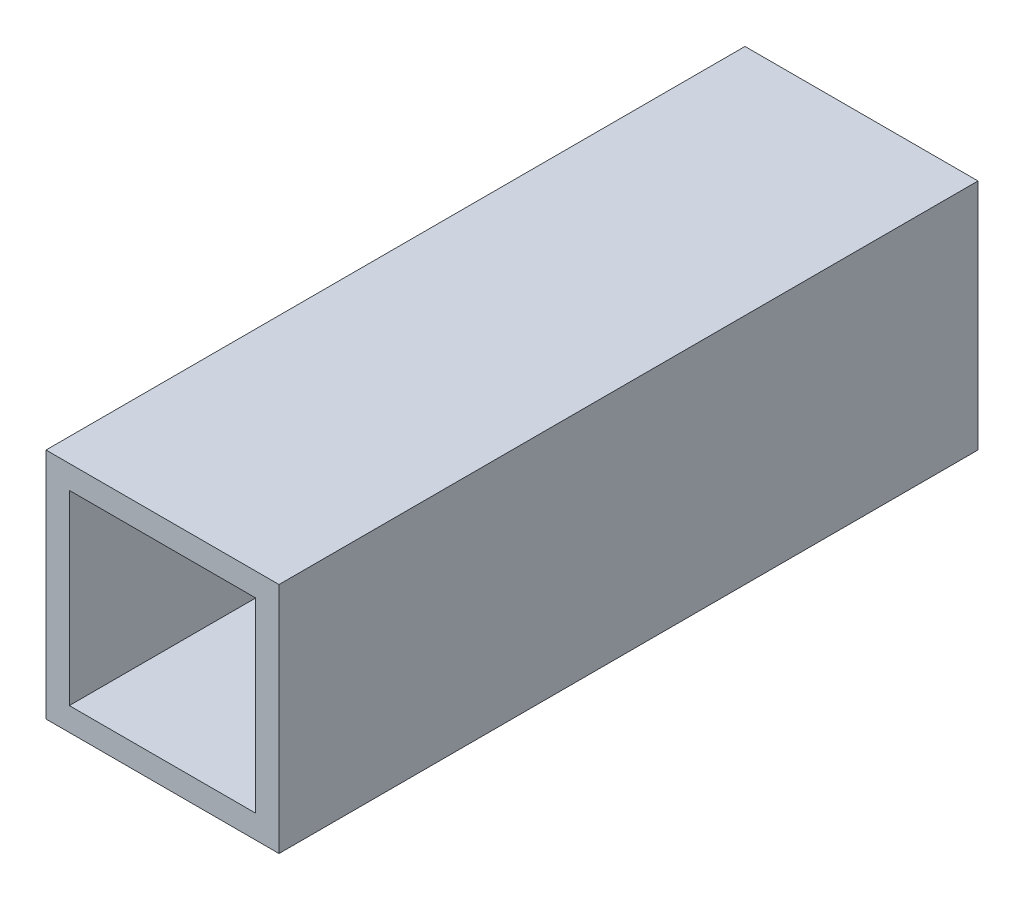
ISO-10303-21;
HEADER;
FILE_DESCRIPTION(('STEP AP214'),'2;1');
FILE_NAME('part.step','',(''),(''),'','','');
FILE_SCHEMA(('AUTOMOTIVE_DESIGN { 1 0 10303 214 1 1 1 1 }'));
ENDSEC;
DATA;
#1=APPLICATION_CONTEXT('core data for automotive mechanical design processes');
#2=APPLICATION_PROTOCOL_DEFINITION('international standard','automotive_design',2000,#1);
#3=PRODUCT_CONTEXT('',#1,'mechanical');
#4=PRODUCT('Part','Part','',(#3));
#5=PRODUCT_RELATED_PRODUCT_CATEGORY('part','',(#4));
#6=PRODUCT_DEFINITION_FORMATION('','',#4);
#7=PRODUCT_DEFINITION_CONTEXT('part definition',#1,'design');
#8=PRODUCT_DEFINITION('design','',#6,#7);
#9=PRODUCT_DEFINITION_SHAPE('','',#8);
#10=(LENGTH_UNIT() NAMED_UNIT(*) SI_UNIT(.MILLI.,.METRE.));
#11=(NAMED_UNIT(*) PLANE_ANGLE_UNIT() SI_UNIT($,.RADIAN.));
#12=(NAMED_UNIT(*) SI_UNIT($,.STERADIAN.) SOLID_ANGLE_UNIT());
#13=UNCERTAINTY_MEASURE_WITH_UNIT(LENGTH_MEASURE(1.E-05),#10,'distance_accuracy_value','');
#14=(GEOMETRIC_REPRESENTATION_CONTEXT(3) GLOBAL_UNCERTAINTY_ASSIGNED_CONTEXT((#13)) GLOBAL_UNIT_ASSIGNED_CONTEXT((#10,
#11,#12)) REPRESENTATION_CONTEXT('',''));
#15=CARTESIAN_POINT('',(0.,0.,0.));
#16=DIRECTION('',(0.,0.,1.));
#17=DIRECTION('',(1.,0.,0.));
#18=AXIS2_PLACEMENT_3D('',#15,#16,#17);
#19=CARTESIAN_POINT('',(-25.,25.,150.));
#20=DIRECTION('',(-1.,0.,0.));
#21=DIRECTION('',(0.,0.,1.));
#22=AXIS2_PLACEMENT_3D('',#19,#20,#21);
#23=PLANE('',#22);
#24=DIRECTION('',(0.,1.,0.));
#25=VECTOR('',#24,1.);
#26=CARTESIAN_POINT('',(-25.,25.,0.));
#27=LINE('',#26,#25);
#28=CARTESIAN_POINT('',(-25.,-25.,0.));
#29=VERTEX_POINT('',#28);
#30=CARTESIAN_POINT('',(-25.,25.,0.));
#31=VERTEX_POINT('',#30);
#32=EDGE_CURVE('E135',#29,#31,#27,.T.);
#33=ORIENTED_EDGE('',*,*,#32,.F.);
#34=DIRECTION('',(0.,0.,-1.));
#35=VECTOR('',#34,1.);
#36=CARTESIAN_POINT('',(-25.,-25.,150.));
#37=LINE('',#36,#35);
#38=CARTESIAN_POINT('',(-25.,-25.,150.));
#39=VERTEX_POINT('',#38);
#40=EDGE_CURVE('E11',#39,#29,#37,.T.);
#41=ORIENTED_EDGE('',*,*,#40,.F.);
#42=DIRECTION('',(0.,1.,0.));
#43=VECTOR('',#42,1.);
#44=CARTESIAN_POINT('',(-25.,25.,150.));
#45=LINE('',#44,#43);
#46=CARTESIAN_POINT('',(-25.,25.,150.));
#47=VERTEX_POINT('',#46);
#48=EDGE_CURVE('E139',#39,#47,#45,.T.);
#49=ORIENTED_EDGE('',*,*,#48,.T.);
#50=DIRECTION('',(0.,0.,-1.));
#51=VECTOR('',#50,1.);
#52=CARTESIAN_POINT('',(-25.,25.,150.));
#53=LINE('',#52,#51);
#54=EDGE_CURVE('E40',#47,#31,#53,.T.);
#55=ORIENTED_EDGE('',*,*,#54,.T.);
#56=EDGE_LOOP('',(#33,#41,#49,#55));
#57=FACE_BOUND('',#56,.T.);
#58=ADVANCED_FACE('F37',(#57),#23,.T.);
#59=CARTESIAN_POINT('',(-25.,-25.,150.));
#60=DIRECTION('',(0.,-1.,0.));
#61=DIRECTION('',(0.,0.,-1.));
#62=AXIS2_PLACEMENT_3D('',#59,#60,#61);
#63=PLANE('',#62);
#64=DIRECTION('',(-1.,0.,0.));
#65=VECTOR('',#64,1.);
#66=CARTESIAN_POINT('',(-25.,-25.,0.));
#67=LINE('',#66,#65);
#68=CARTESIAN_POINT('',(25.,-25.,0.));
#69=VERTEX_POINT('',#68);
#70=EDGE_CURVE('E143',#69,#29,#67,.T.);
#71=ORIENTED_EDGE('',*,*,#70,.F.);
#72=DIRECTION('',(0.,0.,-1.));
#73=VECTOR('',#72,1.);
#74=CARTESIAN_POINT('',(25.,-25.,150.));
#75=LINE('',#74,#73);
#76=CARTESIAN_POINT('',(25.,-25.,150.));
#77=VERTEX_POINT('',#76);
#78=EDGE_CURVE('E45',#77,#69,#75,.T.);
#79=ORIENTED_EDGE('',*,*,#78,.F.);
#80=DIRECTION('',(-1.,0.,0.));
#81=VECTOR('',#80,1.);
#82=CARTESIAN_POINT('',(-25.,-25.,150.));
#83=LINE('',#82,#81);
#84=EDGE_CURVE('E149',#77,#39,#83,.T.);
#85=ORIENTED_EDGE('',*,*,#84,.T.);
#86=ORIENTED_EDGE('',*,*,#40,.T.);
#87=EDGE_LOOP('',(#71,#79,#85,#86));
#88=FACE_BOUND('',#87,.T.);
#89=ADVANCED_FACE('F175',(#88),#63,.T.);
#90=CARTESIAN_POINT('',(25.,25.,150.));
#91=DIRECTION('',(1.,0.,0.));
#92=DIRECTION('',(0.,0.,-1.));
#93=AXIS2_PLACEMENT_3D('',#90,#91,#92);
#94=PLANE('',#93);
#95=DIRECTION('',(0.,-1.,0.));
#96=VECTOR('',#95,1.);
#97=CARTESIAN_POINT('',(25.,25.,0.));
#98=LINE('',#97,#96);
#99=CARTESIAN_POINT('',(25.,25.,0.));
#100=VERTEX_POINT('',#99);
#101=EDGE_CURVE('E157',#100,#69,#98,.T.);
#102=ORIENTED_EDGE('',*,*,#101,.F.);
#103=DIRECTION('',(0.,0.,-1.));
#104=VECTOR('',#103,1.);
#105=CARTESIAN_POINT('',(25.,25.,150.));
#106=LINE('',#105,#104);
#107=CARTESIAN_POINT('',(25.,25.,150.));
#108=VERTEX_POINT('',#107);
#109=EDGE_CURVE('E162',#108,#100,#106,.T.);
#110=ORIENTED_EDGE('',*,*,#109,.F.);
#111=DIRECTION('',(0.,-1.,0.));
#112=VECTOR('',#111,1.);
#113=CARTESIAN_POINT('',(25.,25.,150.));
#114=LINE('',#113,#112);
#115=EDGE_CURVE('E146',#108,#77,#114,.T.);
#116=ORIENTED_EDGE('',*,*,#115,.T.);
#117=ORIENTED_EDGE('',*,*,#78,.T.);
#118=EDGE_LOOP('',(#102,#110,#116,#117));
#119=FACE_BOUND('',#118,.T.);
#120=ADVANCED_FACE('F179',(#119),#94,.T.);
#121=CARTESIAN_POINT('',(-25.,25.,150.));
#122=DIRECTION('',(0.,1.,0.));
#123=DIRECTION('',(0.,0.,1.));
#124=AXIS2_PLACEMENT_3D('',#121,#122,#123);
#125=PLANE('',#124);
#126=DIRECTION('',(1.,0.,0.));
#127=VECTOR('',#126,1.);
#128=CARTESIAN_POINT('',(-25.,25.,0.));
#129=LINE('',#128,#127);
#130=EDGE_CURVE('E154',#31,#100,#129,.T.);
#131=ORIENTED_EDGE('',*,*,#130,.F.);
#132=ORIENTED_EDGE('',*,*,#54,.F.);
#133=DIRECTION('',(1.,0.,0.));
#134=VECTOR('',#133,1.);
#135=CARTESIAN_POINT('',(-25.,25.,150.));
#136=LINE('',#135,#134);
#137=EDGE_CURVE('E142',#47,#108,#136,.T.);
#138=ORIENTED_EDGE('',*,*,#137,.T.);
#139=ORIENTED_EDGE('',*,*,#109,.T.);
#140=EDGE_LOOP('',(#131,#132,#138,#139));
#141=FACE_BOUND('',#140,.T.);
#142=ADVANCED_FACE('F170',(#141),#125,.T.);
#143=CARTESIAN_POINT('',(0.,0.,150.));
#144=DIRECTION('',(0.,0.,1.));
#145=DIRECTION('',(1.,0.,0.));
#146=AXIS2_PLACEMENT_3D('',#143,#144,#145);
#147=PLANE('',#146);
#148=DIRECTION('',(1.,0.,0.));
#149=VECTOR('',#148,1.);
#150=CARTESIAN_POINT('',(-20.,20.,150.));
#151=LINE('',#150,#149);
#152=CARTESIAN_POINT('',(-20.,20.,150.));
#153=VERTEX_POINT('',#152);
#154=CARTESIAN_POINT('',(20.,20.,150.));
#155=VERTEX_POINT('',#154);
#156=EDGE_CURVE('E104',#153,#155,#151,.T.);
#157=ORIENTED_EDGE('',*,*,#156,.T.);
#158=DIRECTION('',(0.,-1.,0.));
#159=VECTOR('',#158,1.);
#160=CARTESIAN_POINT('',(20.,20.,150.));
#161=LINE('',#160,#159);
#162=CARTESIAN_POINT('',(20.,-20.,150.));
#163=VERTEX_POINT('',#162);
#164=EDGE_CURVE('E113',#155,#163,#161,.T.);
#165=ORIENTED_EDGE('',*,*,#164,.T.);
#166=DIRECTION('',(-1.,0.,0.));
#167=VECTOR('',#166,1.);
#168=CARTESIAN_POINT('',(-20.,-20.,150.));
#169=LINE('',#168,#167);
#170=CARTESIAN_POINT('',(-20.,-20.,150.));
#171=VERTEX_POINT('',#170);
#172=EDGE_CURVE('E53',#163,#171,#169,.T.);
#173=ORIENTED_EDGE('',*,*,#172,.T.);
#174=DIRECTION('',(0.,1.,0.));
#175=VECTOR('',#174,1.);
#176=CARTESIAN_POINT('',(-20.,20.,150.));
#177=LINE('',#176,#175);
#178=EDGE_CURVE('E110',#171,#153,#177,.T.);
#179=ORIENTED_EDGE('',*,*,#178,.T.);
#180=EDGE_LOOP('',(#157,#165,#173,#179));
#181=FACE_BOUND('',#180,.T.);
#182=ORIENTED_EDGE('',*,*,#48,.F.);
#183=ORIENTED_EDGE('',*,*,#84,.F.);
#184=ORIENTED_EDGE('',*,*,#115,.F.);
#185=ORIENTED_EDGE('',*,*,#137,.F.);
#186=EDGE_LOOP('',(#182,#183,#184,#185));
#187=FACE_BOUND('',#186,.T.);
#188=ADVANCED_FACE('F117',(#181,#187),#147,.T.);
#189=CARTESIAN_POINT('',(0.,0.,0.));
#190=DIRECTION('',(0.,0.,1.));
#191=DIRECTION('',(1.,0.,0.));
#192=AXIS2_PLACEMENT_3D('',#189,#190,#191);
#193=PLANE('',#192);
#194=DIRECTION('',(0.,-1.,0.));
#195=VECTOR('',#194,1.);
#196=CARTESIAN_POINT('',(20.,20.,0.));
#197=LINE('',#196,#195);
#198=CARTESIAN_POINT('',(20.,20.,0.));
#199=VERTEX_POINT('',#198);
#200=CARTESIAN_POINT('',(20.,-20.,0.));
#201=VERTEX_POINT('',#200);
#202=EDGE_CURVE('E129',#199,#201,#197,.T.);
#203=ORIENTED_EDGE('',*,*,#202,.F.);
#204=DIRECTION('',(1.,0.,0.));
#205=VECTOR('',#204,1.);
#206=CARTESIAN_POINT('',(-20.,20.,0.));
#207=LINE('',#206,#205);
#208=CARTESIAN_POINT('',(-20.,20.,0.));
#209=VERTEX_POINT('',#208);
#210=EDGE_CURVE('E61',#209,#199,#207,.T.);
#211=ORIENTED_EDGE('',*,*,#210,.F.);
#212=DIRECTION('',(0.,1.,0.));
#213=VECTOR('',#212,1.);
#214=CARTESIAN_POINT('',(-20.,20.,0.));
#215=LINE('',#214,#213);
#216=CARTESIAN_POINT('',(-20.,-20.,0.));
#217=VERTEX_POINT('',#216);
#218=EDGE_CURVE('E120',#217,#209,#215,.T.);
#219=ORIENTED_EDGE('',*,*,#218,.F.);
#220=DIRECTION('',(-1.,0.,0.));
#221=VECTOR('',#220,1.);
#222=CARTESIAN_POINT('',(-20.,-20.,0.));
#223=LINE('',#222,#221);
#224=EDGE_CURVE('E123',#201,#217,#223,.T.);
#225=ORIENTED_EDGE('',*,*,#224,.F.);
#226=EDGE_LOOP('',(#203,#211,#219,#225));
#227=FACE_BOUND('',#226,.T.);
#228=ORIENTED_EDGE('',*,*,#32,.T.);
#229=ORIENTED_EDGE('',*,*,#130,.T.);
#230=ORIENTED_EDGE('',*,*,#101,.T.);
#231=ORIENTED_EDGE('',*,*,#70,.T.);
#232=EDGE_LOOP('',(#228,#229,#230,#231));
#233=FACE_BOUND('',#232,.T.);
#234=ADVANCED_FACE('F172',(#227,#233),#193,.F.);
#235=CARTESIAN_POINT('',(-20.,20.,150.));
#236=DIRECTION('',(0.,1.,0.));
#237=DIRECTION('',(0.,0.,1.));
#238=AXIS2_PLACEMENT_3D('',#235,#236,#237);
#239=PLANE('',#238);
#240=ORIENTED_EDGE('',*,*,#210,.T.);
#241=DIRECTION('',(0.,0.,-1.));
#242=VECTOR('',#241,1.);
#243=CARTESIAN_POINT('',(20.,20.,150.));
#244=LINE('',#243,#242);
#245=EDGE_CURVE('E100',#155,#199,#244,.T.);
#246=ORIENTED_EDGE('',*,*,#245,.F.);
#247=ORIENTED_EDGE('',*,*,#156,.F.);
#248=DIRECTION('',(0.,0.,-1.));
#249=VECTOR('',#248,1.);
#250=CARTESIAN_POINT('',(-20.,20.,150.));
#251=LINE('',#250,#249);
#252=EDGE_CURVE('E133',#153,#209,#251,.T.);
#253=ORIENTED_EDGE('',*,*,#252,.T.);
#254=EDGE_LOOP('',(#240,#246,#247,#253));
#255=FACE_BOUND('',#254,.T.);
#256=ADVANCED_FACE('F102',(#255),#239,.F.);
#257=CARTESIAN_POINT('',(-20.,20.,150.));
#258=DIRECTION('',(-1.,0.,0.));
#259=DIRECTION('',(0.,0.,1.));
#260=AXIS2_PLACEMENT_3D('',#257,#258,#259);
#261=PLANE('',#260);
#262=ORIENTED_EDGE('',*,*,#218,.T.);
#263=ORIENTED_EDGE('',*,*,#252,.F.);
#264=ORIENTED_EDGE('',*,*,#178,.F.);
#265=DIRECTION('',(0.,0.,-1.));
#266=VECTOR('',#265,1.);
#267=CARTESIAN_POINT('',(-20.,-20.,150.));
#268=LINE('',#267,#266);
#269=EDGE_CURVE('E136',#171,#217,#268,.T.);
#270=ORIENTED_EDGE('',*,*,#269,.T.);
#271=EDGE_LOOP('',(#262,#263,#264,#270));
#272=FACE_BOUND('',#271,.T.);
#273=ADVANCED_FACE('F230',(#272),#261,.F.);
#274=CARTESIAN_POINT('',(-20.,-20.,150.));
#275=DIRECTION('',(0.,-1.,0.));
#276=DIRECTION('',(0.,0.,-1.));
#277=AXIS2_PLACEMENT_3D('',#274,#275,#276);
#278=PLANE('',#277);
#279=ORIENTED_EDGE('',*,*,#224,.T.);
#280=ORIENTED_EDGE('',*,*,#269,.F.);
#281=ORIENTED_EDGE('',*,*,#172,.F.);
#282=DIRECTION('',(0.,0.,-1.));
#283=VECTOR('',#282,1.);
#284=CARTESIAN_POINT('',(20.,-20.,150.));
#285=LINE('',#284,#283);
#286=EDGE_CURVE('E109',#163,#201,#285,.T.);
#287=ORIENTED_EDGE('',*,*,#286,.T.);
#288=EDGE_LOOP('',(#279,#280,#281,#287));
#289=FACE_BOUND('',#288,.T.);
#290=ADVANCED_FACE('F239',(#289),#278,.F.);
#291=CARTESIAN_POINT('',(20.,20.,150.));
#292=DIRECTION('',(1.,0.,0.));
#293=DIRECTION('',(0.,0.,-1.));
#294=AXIS2_PLACEMENT_3D('',#291,#292,#293);
#295=PLANE('',#294);
#296=ORIENTED_EDGE('',*,*,#202,.T.);
#297=ORIENTED_EDGE('',*,*,#286,.F.);
#298=ORIENTED_EDGE('',*,*,#164,.F.);
#299=ORIENTED_EDGE('',*,*,#245,.T.);
#300=EDGE_LOOP('',(#296,#297,#298,#299));
#301=FACE_BOUND('',#300,.T.);
#302=ADVANCED_FACE('F114',(#301),#295,.F.);
#303=CLOSED_SHELL('',(#58,#89,#120,#142,#188,#234,#256,#273,#290,#302));
#304=MANIFOLD_SOLID_BREP('B2',#303);
#305=ADVANCED_BREP_SHAPE_REPRESENTATION('',(#18,#304),#14);
#306=SHAPE_DEFINITION_REPRESENTATION(#9,#305);
ENDSEC;
END-ISO-10303-21;
